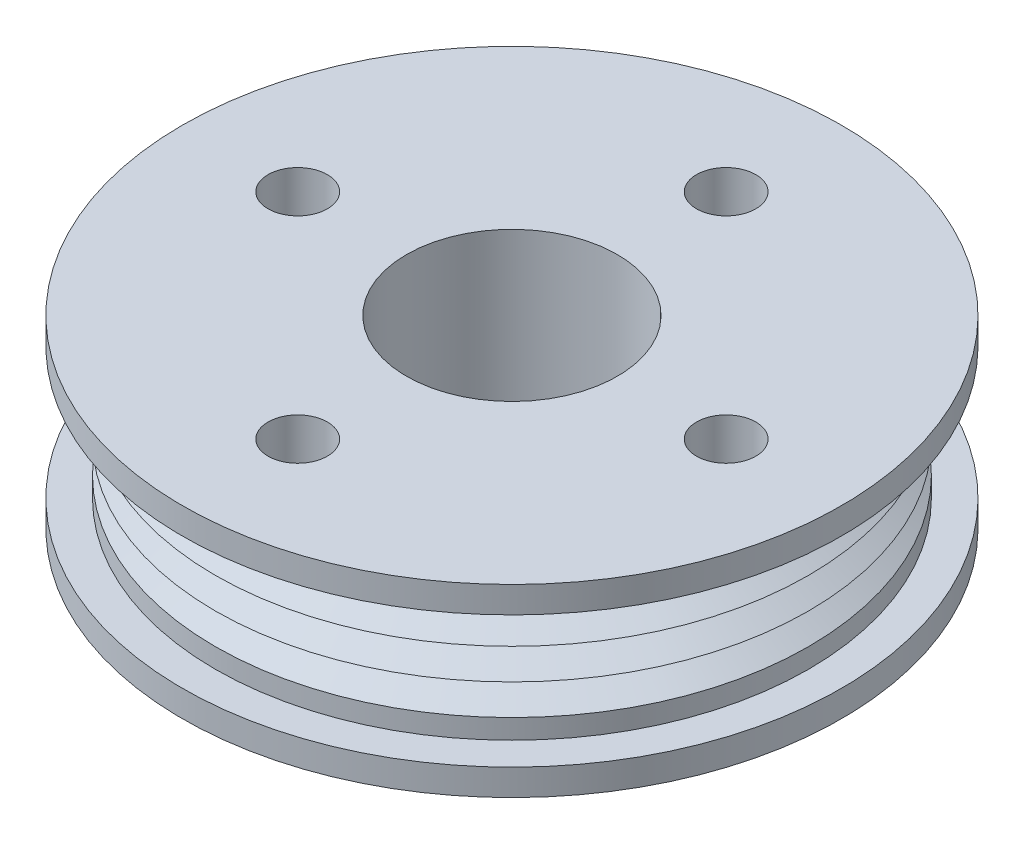
ISO-10303-21;
HEADER;
FILE_DESCRIPTION(('STEP AP214'),'2;1');
FILE_NAME('part.step','',(''),(''),'','','');
FILE_SCHEMA(('AUTOMOTIVE_DESIGN { 1 0 10303 214 1 1 1 1 }'));
ENDSEC;
DATA;
#1=APPLICATION_CONTEXT('core data for automotive mechanical design processes');
#2=APPLICATION_PROTOCOL_DEFINITION('international standard','automotive_design',2000,#1);
#3=PRODUCT_CONTEXT('',#1,'mechanical');
#4=PRODUCT('Part','Part','',(#3));
#5=PRODUCT_RELATED_PRODUCT_CATEGORY('part','',(#4));
#6=PRODUCT_DEFINITION_FORMATION('','',#4);
#7=PRODUCT_DEFINITION_CONTEXT('part definition',#1,'design');
#8=PRODUCT_DEFINITION('design','',#6,#7);
#9=PRODUCT_DEFINITION_SHAPE('','',#8);
#10=(LENGTH_UNIT() NAMED_UNIT(*) SI_UNIT(.MILLI.,.METRE.));
#11=(NAMED_UNIT(*) PLANE_ANGLE_UNIT() SI_UNIT($,.RADIAN.));
#12=(NAMED_UNIT(*) SI_UNIT($,.STERADIAN.) SOLID_ANGLE_UNIT());
#13=UNCERTAINTY_MEASURE_WITH_UNIT(LENGTH_MEASURE(1.E-05),#10,'distance_accuracy_value','');
#14=(GEOMETRIC_REPRESENTATION_CONTEXT(3) GLOBAL_UNCERTAINTY_ASSIGNED_CONTEXT((#13)) GLOBAL_UNIT_ASSIGNED_CONTEXT((#10,
#11,#12)) REPRESENTATION_CONTEXT('',''));
#15=CARTESIAN_POINT('',(0.,0.,0.));
#16=DIRECTION('',(0.,0.,1.));
#17=DIRECTION('',(1.,0.,0.));
#18=AXIS2_PLACEMENT_3D('',#15,#16,#17);
#19=CARTESIAN_POINT('',(0.,-7.,0.));
#20=DIRECTION('',(0.,-1.,0.));
#21=DIRECTION('',(1.,0.,0.));
#22=AXIS2_PLACEMENT_3D('',#19,#20,#21);
#23=PLANE('',#22);
#24=CARTESIAN_POINT('',(1.72352847167111E-13,-7.,-16.25));
#25=DIRECTION('',(0.,1.,0.));
#26=DIRECTION('',(-1.,0.,0.));
#27=AXIS2_PLACEMENT_3D('',#24,#25,#26);
#28=CIRCLE('',#27,2.25);
#29=CARTESIAN_POINT('',(-2.24999999999983,-7.,-16.25));
#30=VERTEX_POINT('',#29);
#31=EDGE_CURVE('E99',#30,#30,#28,.T.);
#32=ORIENTED_EDGE('',*,*,#31,.T.);
#33=EDGE_LOOP('',(#32));
#34=FACE_BOUND('',#33,.T.);
#35=CARTESIAN_POINT('',(-16.25,-7.,-1.13473143512402E-13));
#36=DIRECTION('',(0.,1.,0.));
#37=DIRECTION('',(-1.,0.,0.));
#38=AXIS2_PLACEMENT_3D('',#35,#36,#37);
#39=CIRCLE('',#38,2.25);
#40=CARTESIAN_POINT('',(-18.5,-7.,-1.13473143512402E-13));
#41=VERTEX_POINT('',#40);
#42=EDGE_CURVE('E88',#41,#41,#39,.T.);
#43=ORIENTED_EDGE('',*,*,#42,.T.);
#44=EDGE_LOOP('',(#43));
#45=FACE_BOUND('',#44,.T.);
#46=CARTESIAN_POINT('',(0.,-7.,16.25));
#47=DIRECTION('',(0.,1.,0.));
#48=DIRECTION('',(-1.,0.,0.));
#49=AXIS2_PLACEMENT_3D('',#46,#47,#48);
#50=CIRCLE('',#49,2.25);
#51=CARTESIAN_POINT('',(-2.25000000000005,-7.,16.25));
#52=VERTEX_POINT('',#51);
#53=EDGE_CURVE('E87',#52,#52,#50,.T.);
#54=ORIENTED_EDGE('',*,*,#53,.T.);
#55=EDGE_LOOP('',(#54));
#56=FACE_BOUND('',#55,.T.);
#57=CARTESIAN_POINT('',(0.,-7.,0.));
#58=DIRECTION('',(0.,1.,0.));
#59=DIRECTION('',(-1.,0.,0.));
#60=AXIS2_PLACEMENT_3D('',#57,#58,#59);
#61=CIRCLE('',#60,8.);
#62=CARTESIAN_POINT('',(-8.,-7.,0.));
#63=VERTEX_POINT('',#62);
#64=EDGE_CURVE('E81',#63,#63,#61,.T.);
#65=ORIENTED_EDGE('',*,*,#64,.T.);
#66=EDGE_LOOP('',(#65));
#67=FACE_BOUND('',#66,.T.);
#68=CARTESIAN_POINT('',(16.25,-6.99999999999999,0.));
#69=DIRECTION('',(0.,1.,0.));
#70=DIRECTION('',(-1.,0.,0.));
#71=AXIS2_PLACEMENT_3D('',#68,#69,#70);
#72=CIRCLE('',#71,2.25);
#73=CARTESIAN_POINT('',(14.,-6.99999999999999,0.));
#74=VERTEX_POINT('',#73);
#75=EDGE_CURVE('E77',#74,#74,#72,.T.);
#76=ORIENTED_EDGE('',*,*,#75,.T.);
#77=EDGE_LOOP('',(#76));
#78=FACE_BOUND('',#77,.T.);
#79=CARTESIAN_POINT('',(0.,-7.,0.));
#80=DIRECTION('',(0.,1.,0.));
#81=DIRECTION('',(-1.,0.,0.));
#82=AXIS2_PLACEMENT_3D('',#79,#80,#81);
#83=CIRCLE('',#82,25.);
#84=CARTESIAN_POINT('',(-25.,-7.,0.));
#85=VERTEX_POINT('',#84);
#86=EDGE_CURVE('E10',#85,#85,#83,.T.);
#87=ORIENTED_EDGE('',*,*,#86,.F.);
#88=EDGE_LOOP('',(#87));
#89=FACE_BOUND('',#88,.T.);
#90=ADVANCED_FACE('F31',(#34,#45,#56,#67,#78,#89),#23,.T.);
#91=CARTESIAN_POINT('',(0.,7.,0.));
#92=DIRECTION('',(0.,1.,0.));
#93=DIRECTION('',(-1.,0.,0.));
#94=AXIS2_PLACEMENT_3D('',#91,#92,#93);
#95=CYLINDRICAL_SURFACE('',#94,25.);
#96=ORIENTED_EDGE('',*,*,#86,.T.);
#97=EDGE_LOOP('',(#96));
#98=FACE_BOUND('',#97,.T.);
#99=CARTESIAN_POINT('',(0.,-4.99999999999998,0.));
#100=DIRECTION('',(0.,1.,0.));
#101=DIRECTION('',(-1.,0.,0.));
#102=AXIS2_PLACEMENT_3D('',#99,#100,#101);
#103=CIRCLE('',#102,25.);
#104=CARTESIAN_POINT('',(-25.,-4.99999999999998,0.));
#105=VERTEX_POINT('',#104);
#106=EDGE_CURVE('E37',#105,#105,#103,.T.);
#107=ORIENTED_EDGE('',*,*,#106,.F.);
#108=EDGE_LOOP('',(#107));
#109=FACE_BOUND('',#108,.T.);
#110=ADVANCED_FACE('F144',(#98,#109),#95,.T.);
#111=CARTESIAN_POINT('',(-22.5,-4.99999999999998,0.));
#112=DIRECTION('',(0.,1.,0.));
#113=DIRECTION('',(-1.,0.,0.));
#114=AXIS2_PLACEMENT_3D('',#111,#112,#113);
#115=PLANE('',#114);
#116=ORIENTED_EDGE('',*,*,#106,.T.);
#117=EDGE_LOOP('',(#116));
#118=FACE_BOUND('',#117,.T.);
#119=CARTESIAN_POINT('',(0.,-4.99999999999998,0.));
#120=DIRECTION('',(0.,1.,0.));
#121=DIRECTION('',(-1.,0.,0.));
#122=AXIS2_PLACEMENT_3D('',#119,#120,#121);
#123=CIRCLE('',#122,22.5);
#124=CARTESIAN_POINT('',(-22.5,-4.99999999999998,0.));
#125=VERTEX_POINT('',#124);
#126=EDGE_CURVE('E41',#125,#125,#123,.T.);
#127=ORIENTED_EDGE('',*,*,#126,.F.);
#128=EDGE_LOOP('',(#127));
#129=FACE_BOUND('',#128,.T.);
#130=ADVANCED_FACE('F149',(#118,#129),#115,.T.);
#131=CARTESIAN_POINT('',(0.,7.,0.));
#132=DIRECTION('',(0.,1.,0.));
#133=DIRECTION('',(-1.,0.,0.));
#134=AXIS2_PLACEMENT_3D('',#131,#132,#133);
#135=CYLINDRICAL_SURFACE('',#134,22.5);
#136=ORIENTED_EDGE('',*,*,#126,.T.);
#137=EDGE_LOOP('',(#136));
#138=FACE_BOUND('',#137,.T.);
#139=CARTESIAN_POINT('',(0.,-3.50999999999999,0.));
#140=DIRECTION('',(0.,1.,0.));
#141=DIRECTION('',(-1.,0.,0.));
#142=AXIS2_PLACEMENT_3D('',#139,#140,#141);
#143=CIRCLE('',#142,22.5);
#144=CARTESIAN_POINT('',(-22.5,-3.51,0.));
#145=VERTEX_POINT('',#144);
#146=EDGE_CURVE('E45',#145,#145,#143,.T.);
#147=ORIENTED_EDGE('',*,*,#146,.F.);
#148=EDGE_LOOP('',(#147));
#149=FACE_BOUND('',#148,.T.);
#150=ADVANCED_FACE('F275',(#138,#149),#135,.T.);
#151=CARTESIAN_POINT('',(0.,-2.34000000000006,0.));
#152=DIRECTION('',(0.,-1.,0.));
#153=DIRECTION('',(1.,0.,0.));
#154=AXIS2_PLACEMENT_3D('',#151,#152,#153);
#155=CONICAL_SURFACE('',#154,20.6999999999999,0.994421106203765);
#156=ORIENTED_EDGE('',*,*,#146,.T.);
#157=EDGE_LOOP('',(#156));
#158=FACE_BOUND('',#157,.T.);
#159=CARTESIAN_POINT('',(0.,-2.34000000000006,0.));
#160=DIRECTION('',(0.,1.,0.));
#161=DIRECTION('',(-1.,0.,0.));
#162=AXIS2_PLACEMENT_3D('',#159,#160,#161);
#163=CIRCLE('',#162,20.6999999999999);
#164=CARTESIAN_POINT('',(-20.6999999999999,-2.34000000000006,0.));
#165=VERTEX_POINT('',#164);
#166=EDGE_CURVE('E50',#165,#165,#163,.T.);
#167=ORIENTED_EDGE('',*,*,#166,.F.);
#168=EDGE_LOOP('',(#167));
#169=FACE_BOUND('',#168,.T.);
#170=ADVANCED_FACE('F266',(#158,#169),#155,.T.);
#171=CARTESIAN_POINT('',(0.,-1.16999999999999,0.));
#172=DIRECTION('',(0.,1.,0.));
#173=DIRECTION('',(-1.,0.,0.));
#174=AXIS2_PLACEMENT_3D('',#171,#172,#173);
#175=CONICAL_SURFACE('',#174,22.4999999999999,0.994421106203688);
#176=ORIENTED_EDGE('',*,*,#166,.T.);
#177=EDGE_LOOP('',(#176));
#178=FACE_BOUND('',#177,.T.);
#179=CARTESIAN_POINT('',(0.,-1.16999999999999,0.));
#180=DIRECTION('',(0.,1.,0.));
#181=DIRECTION('',(-1.,0.,0.));
#182=AXIS2_PLACEMENT_3D('',#179,#180,#181);
#183=CIRCLE('',#182,22.4999999999999);
#184=CARTESIAN_POINT('',(-22.4999999999999,-1.16999999999999,0.));
#185=VERTEX_POINT('',#184);
#186=EDGE_CURVE('E53',#185,#185,#183,.T.);
#187=ORIENTED_EDGE('',*,*,#186,.F.);
#188=EDGE_LOOP('',(#187));
#189=FACE_BOUND('',#188,.T.);
#190=ADVANCED_FACE('F257',(#178,#189),#175,.T.);
#191=CARTESIAN_POINT('',(0.,0.,0.));
#192=DIRECTION('',(0.,-1.,0.));
#193=DIRECTION('',(1.,0.,0.));
#194=AXIS2_PLACEMENT_3D('',#191,#192,#193);
#195=CONICAL_SURFACE('',#194,20.6999999999999,0.994421106203711);
#196=ORIENTED_EDGE('',*,*,#186,.T.);
#197=EDGE_LOOP('',(#196));
#198=FACE_BOUND('',#197,.T.);
#199=CARTESIAN_POINT('',(0.,0.,0.));
#200=DIRECTION('',(0.,1.,0.));
#201=DIRECTION('',(-1.,0.,0.));
#202=AXIS2_PLACEMENT_3D('',#199,#200,#201);
#203=CIRCLE('',#202,20.6999999999999);
#204=CARTESIAN_POINT('',(-20.6999999999999,0.,0.));
#205=VERTEX_POINT('',#204);
#206=EDGE_CURVE('E56',#205,#205,#203,.T.);
#207=ORIENTED_EDGE('',*,*,#206,.F.);
#208=EDGE_LOOP('',(#207));
#209=FACE_BOUND('',#208,.T.);
#210=ADVANCED_FACE('F248',(#198,#209),#195,.T.);
#211=CARTESIAN_POINT('',(0.,1.17000000000001,0.));
#212=DIRECTION('',(0.,1.,0.));
#213=DIRECTION('',(-1.,0.,0.));
#214=AXIS2_PLACEMENT_3D('',#211,#212,#213);
#215=CONICAL_SURFACE('',#214,22.4999999999999,0.994421106203709);
#216=ORIENTED_EDGE('',*,*,#206,.T.);
#217=EDGE_LOOP('',(#216));
#218=FACE_BOUND('',#217,.T.);
#219=CARTESIAN_POINT('',(0.,1.17000000000001,0.));
#220=DIRECTION('',(0.,1.,0.));
#221=DIRECTION('',(-1.,0.,0.));
#222=AXIS2_PLACEMENT_3D('',#219,#220,#221);
#223=CIRCLE('',#222,22.4999999999999);
#224=CARTESIAN_POINT('',(-22.4999999999999,1.17000000000001,0.));
#225=VERTEX_POINT('',#224);
#226=EDGE_CURVE('E59',#225,#225,#223,.T.);
#227=ORIENTED_EDGE('',*,*,#226,.F.);
#228=EDGE_LOOP('',(#227));
#229=FACE_BOUND('',#228,.T.);
#230=ADVANCED_FACE('F239',(#218,#229),#215,.T.);
#231=CARTESIAN_POINT('',(0.,2.33999999999998,0.));
#232=DIRECTION('',(0.,-1.,0.));
#233=DIRECTION('',(1.,0.,0.));
#234=AXIS2_PLACEMENT_3D('',#231,#232,#233);
#235=CONICAL_SURFACE('',#234,20.7,0.994421106203704);
#236=ORIENTED_EDGE('',*,*,#226,.T.);
#237=EDGE_LOOP('',(#236));
#238=FACE_BOUND('',#237,.T.);
#239=CARTESIAN_POINT('',(0.,2.33999999999998,0.));
#240=DIRECTION('',(0.,1.,0.));
#241=DIRECTION('',(-1.,0.,0.));
#242=AXIS2_PLACEMENT_3D('',#239,#240,#241);
#243=CIRCLE('',#242,20.7);
#244=CARTESIAN_POINT('',(-20.7,2.33999999999997,0.));
#245=VERTEX_POINT('',#244);
#246=EDGE_CURVE('E62',#245,#245,#243,.T.);
#247=ORIENTED_EDGE('',*,*,#246,.F.);
#248=EDGE_LOOP('',(#247));
#249=FACE_BOUND('',#248,.T.);
#250=ADVANCED_FACE('F230',(#238,#249),#235,.T.);
#251=CARTESIAN_POINT('',(0.,3.51,0.));
#252=DIRECTION('',(0.,1.,0.));
#253=DIRECTION('',(-1.,0.,0.));
#254=AXIS2_PLACEMENT_3D('',#251,#252,#253);
#255=CONICAL_SURFACE('',#254,22.5,0.994421106203703);
#256=ORIENTED_EDGE('',*,*,#246,.T.);
#257=EDGE_LOOP('',(#256));
#258=FACE_BOUND('',#257,.T.);
#259=CARTESIAN_POINT('',(0.,3.51,0.));
#260=DIRECTION('',(0.,1.,0.));
#261=DIRECTION('',(-1.,0.,0.));
#262=AXIS2_PLACEMENT_3D('',#259,#260,#261);
#263=CIRCLE('',#262,22.5);
#264=CARTESIAN_POINT('',(-22.5,3.51,0.));
#265=VERTEX_POINT('',#264);
#266=EDGE_CURVE('E65',#265,#265,#263,.T.);
#267=ORIENTED_EDGE('',*,*,#266,.F.);
#268=EDGE_LOOP('',(#267));
#269=FACE_BOUND('',#268,.T.);
#270=ADVANCED_FACE('F221',(#258,#269),#255,.T.);
#271=CARTESIAN_POINT('',(0.,7.,0.));
#272=DIRECTION('',(0.,1.,0.));
#273=DIRECTION('',(-1.,0.,0.));
#274=AXIS2_PLACEMENT_3D('',#271,#272,#273);
#275=CYLINDRICAL_SURFACE('',#274,22.5);
#276=ORIENTED_EDGE('',*,*,#266,.T.);
#277=EDGE_LOOP('',(#276));
#278=FACE_BOUND('',#277,.T.);
#279=CARTESIAN_POINT('',(0.,5.00000000000002,0.));
#280=DIRECTION('',(0.,1.,0.));
#281=DIRECTION('',(-1.,0.,0.));
#282=AXIS2_PLACEMENT_3D('',#279,#280,#281);
#283=CIRCLE('',#282,22.5);
#284=CARTESIAN_POINT('',(-22.5,5.00000000000002,0.));
#285=VERTEX_POINT('',#284);
#286=EDGE_CURVE('E68',#285,#285,#283,.T.);
#287=ORIENTED_EDGE('',*,*,#286,.F.);
#288=EDGE_LOOP('',(#287));
#289=FACE_BOUND('',#288,.T.);
#290=ADVANCED_FACE('F140',(#278,#289),#275,.T.);
#291=CARTESIAN_POINT('',(-25.,5.00000000000002,0.));
#292=DIRECTION('',(0.,-1.,0.));
#293=DIRECTION('',(1.,0.,0.));
#294=AXIS2_PLACEMENT_3D('',#291,#292,#293);
#295=PLANE('',#294);
#296=ORIENTED_EDGE('',*,*,#286,.T.);
#297=EDGE_LOOP('',(#296));
#298=FACE_BOUND('',#297,.T.);
#299=CARTESIAN_POINT('',(0.,5.00000000000002,0.));
#300=DIRECTION('',(0.,1.,0.));
#301=DIRECTION('',(-1.,0.,0.));
#302=AXIS2_PLACEMENT_3D('',#299,#300,#301);
#303=CIRCLE('',#302,25.);
#304=CARTESIAN_POINT('',(-25.,5.00000000000002,0.));
#305=VERTEX_POINT('',#304);
#306=EDGE_CURVE('E71',#305,#305,#303,.T.);
#307=ORIENTED_EDGE('',*,*,#306,.F.);
#308=EDGE_LOOP('',(#307));
#309=FACE_BOUND('',#308,.T.);
#310=ADVANCED_FACE('F134',(#298,#309),#295,.T.);
#311=CARTESIAN_POINT('',(0.,7.,0.));
#312=DIRECTION('',(0.,1.,0.));
#313=DIRECTION('',(-1.,0.,0.));
#314=AXIS2_PLACEMENT_3D('',#311,#312,#313);
#315=CYLINDRICAL_SURFACE('',#314,25.);
#316=ORIENTED_EDGE('',*,*,#306,.T.);
#317=EDGE_LOOP('',(#316));
#318=FACE_BOUND('',#317,.T.);
#319=CARTESIAN_POINT('',(0.,7.,0.));
#320=DIRECTION('',(0.,1.,0.));
#321=DIRECTION('',(-1.,0.,0.));
#322=AXIS2_PLACEMENT_3D('',#319,#320,#321);
#323=CIRCLE('',#322,25.);
#324=CARTESIAN_POINT('',(-25.,7.,0.));
#325=VERTEX_POINT('',#324);
#326=EDGE_CURVE('E74',#325,#325,#323,.T.);
#327=ORIENTED_EDGE('',*,*,#326,.F.);
#328=EDGE_LOOP('',(#327));
#329=FACE_BOUND('',#328,.T.);
#330=ADVANCED_FACE('F122',(#318,#329),#315,.T.);
#331=CARTESIAN_POINT('',(0.,7.,0.));
#332=DIRECTION('',(0.,1.,0.));
#333=DIRECTION('',(-1.,0.,0.));
#334=AXIS2_PLACEMENT_3D('',#331,#332,#333);
#335=PLANE('',#334);
#336=CARTESIAN_POINT('',(1.68066583370095E-13,7.,-16.25));
#337=DIRECTION('',(0.,1.,0.));
#338=DIRECTION('',(-1.,0.,0.));
#339=AXIS2_PLACEMENT_3D('',#336,#337,#338);
#340=CIRCLE('',#339,2.25);
#341=CARTESIAN_POINT('',(-2.24999999999983,7.,-16.25));
#342=VERTEX_POINT('',#341);
#343=EDGE_CURVE('E96',#342,#342,#340,.T.);
#344=ORIENTED_EDGE('',*,*,#343,.F.);
#345=EDGE_LOOP('',(#344));
#346=FACE_BOUND('',#345,.T.);
#347=CARTESIAN_POINT('',(-16.25,7.,-1.13473143512402E-13));
#348=DIRECTION('',(0.,1.,0.));
#349=DIRECTION('',(-1.,0.,0.));
#350=AXIS2_PLACEMENT_3D('',#347,#348,#349);
#351=CIRCLE('',#350,2.25);
#352=CARTESIAN_POINT('',(-18.5,7.,-1.13473143512402E-13));
#353=VERTEX_POINT('',#352);
#354=EDGE_CURVE('E102',#353,#353,#351,.T.);
#355=ORIENTED_EDGE('',*,*,#354,.F.);
#356=EDGE_LOOP('',(#355));
#357=FACE_BOUND('',#356,.T.);
#358=CARTESIAN_POINT('',(0.,7.,16.25));
#359=DIRECTION('',(0.,1.,0.));
#360=DIRECTION('',(-1.,0.,0.));
#361=AXIS2_PLACEMENT_3D('',#358,#359,#360);
#362=CIRCLE('',#361,2.25);
#363=CARTESIAN_POINT('',(-2.25000000000006,7.,16.25));
#364=VERTEX_POINT('',#363);
#365=EDGE_CURVE('E84',#364,#364,#362,.T.);
#366=ORIENTED_EDGE('',*,*,#365,.F.);
#367=EDGE_LOOP('',(#366));
#368=FACE_BOUND('',#367,.T.);
#369=CARTESIAN_POINT('',(0.,7.,0.));
#370=DIRECTION('',(0.,1.,0.));
#371=DIRECTION('',(-1.,0.,0.));
#372=AXIS2_PLACEMENT_3D('',#369,#370,#371);
#373=CIRCLE('',#372,8.);
#374=CARTESIAN_POINT('',(-8.,7.,0.));
#375=VERTEX_POINT('',#374);
#376=EDGE_CURVE('E91',#375,#375,#373,.T.);
#377=ORIENTED_EDGE('',*,*,#376,.F.);
#378=EDGE_LOOP('',(#377));
#379=FACE_BOUND('',#378,.T.);
#380=CARTESIAN_POINT('',(16.25,7.00000000000001,0.));
#381=DIRECTION('',(0.,1.,0.));
#382=DIRECTION('',(-1.,0.,0.));
#383=AXIS2_PLACEMENT_3D('',#380,#381,#382);
#384=CIRCLE('',#383,2.25);
#385=CARTESIAN_POINT('',(14.,7.00000000000001,0.));
#386=VERTEX_POINT('',#385);
#387=EDGE_CURVE('E78',#386,#386,#384,.T.);
#388=ORIENTED_EDGE('',*,*,#387,.F.);
#389=EDGE_LOOP('',(#388));
#390=FACE_BOUND('',#389,.T.);
#391=ORIENTED_EDGE('',*,*,#326,.T.);
#392=EDGE_LOOP('',(#391));
#393=FACE_BOUND('',#392,.T.);
#394=ADVANCED_FACE('F118',(#346,#357,#368,#379,#390,#393),#335,.T.);
#395=CARTESIAN_POINT('',(16.25,-6.99999999999999,0.));
#396=DIRECTION('',(0.,1.,0.));
#397=DIRECTION('',(-1.,0.,0.));
#398=AXIS2_PLACEMENT_3D('',#395,#396,#397);
#399=CYLINDRICAL_SURFACE('',#398,2.25);
#400=ORIENTED_EDGE('',*,*,#75,.F.);
#401=EDGE_LOOP('',(#400));
#402=FACE_BOUND('',#401,.T.);
#403=ORIENTED_EDGE('',*,*,#387,.T.);
#404=EDGE_LOOP('',(#403));
#405=FACE_BOUND('',#404,.T.);
#406=ADVANCED_FACE('F121',(#402,#405),#399,.F.);
#407=CARTESIAN_POINT('',(0.,-7.,0.));
#408=DIRECTION('',(0.,1.,0.));
#409=DIRECTION('',(-1.,0.,0.));
#410=AXIS2_PLACEMENT_3D('',#407,#408,#409);
#411=CYLINDRICAL_SURFACE('',#410,8.);
#412=ORIENTED_EDGE('',*,*,#64,.F.);
#413=EDGE_LOOP('',(#412));
#414=FACE_BOUND('',#413,.T.);
#415=ORIENTED_EDGE('',*,*,#376,.T.);
#416=EDGE_LOOP('',(#415));
#417=FACE_BOUND('',#416,.T.);
#418=ADVANCED_FACE('F159',(#414,#417),#411,.F.);
#419=CARTESIAN_POINT('',(0.,-7.,16.25));
#420=DIRECTION('',(0.,1.,0.));
#421=DIRECTION('',(-1.,0.,0.));
#422=AXIS2_PLACEMENT_3D('',#419,#420,#421);
#423=CYLINDRICAL_SURFACE('',#422,2.25);
#424=ORIENTED_EDGE('',*,*,#53,.F.);
#425=EDGE_LOOP('',(#424));
#426=FACE_BOUND('',#425,.T.);
#427=ORIENTED_EDGE('',*,*,#365,.T.);
#428=EDGE_LOOP('',(#427));
#429=FACE_BOUND('',#428,.T.);
#430=ADVANCED_FACE('F114',(#426,#429),#423,.F.);
#431=CARTESIAN_POINT('',(-16.25,-7.,-1.13473143512402E-13));
#432=DIRECTION('',(0.,1.,0.));
#433=DIRECTION('',(-1.,0.,0.));
#434=AXIS2_PLACEMENT_3D('',#431,#432,#433);
#435=CYLINDRICAL_SURFACE('',#434,2.25);
#436=ORIENTED_EDGE('',*,*,#42,.F.);
#437=EDGE_LOOP('',(#436));
#438=FACE_BOUND('',#437,.T.);
#439=ORIENTED_EDGE('',*,*,#354,.T.);
#440=EDGE_LOOP('',(#439));
#441=FACE_BOUND('',#440,.T.);
#442=ADVANCED_FACE('F110',(#438,#441),#435,.F.);
#443=CARTESIAN_POINT('',(1.72352847167111E-13,-7.,-16.25));
#444=DIRECTION('',(0.,1.,0.));
#445=DIRECTION('',(-1.,0.,0.));
#446=AXIS2_PLACEMENT_3D('',#443,#444,#445);
#447=CYLINDRICAL_SURFACE('',#446,2.25);
#448=ORIENTED_EDGE('',*,*,#31,.F.);
#449=EDGE_LOOP('',(#448));
#450=FACE_BOUND('',#449,.T.);
#451=ORIENTED_EDGE('',*,*,#343,.T.);
#452=EDGE_LOOP('',(#451));
#453=FACE_BOUND('',#452,.T.);
#454=ADVANCED_FACE('F113',(#450,#453),#447,.F.);
#455=CLOSED_SHELL('',(#90,#110,#130,#150,#170,#190,#210,#230,#250,#270,#290,#310,#330,#394,#406,
#418,#430,#442,#454));
#456=MANIFOLD_SOLID_BREP('B2',#455);
#457=ADVANCED_BREP_SHAPE_REPRESENTATION('',(#18,#456),#14);
#458=SHAPE_DEFINITION_REPRESENTATION(#9,#457);
ENDSEC;
END-ISO-10303-21;
